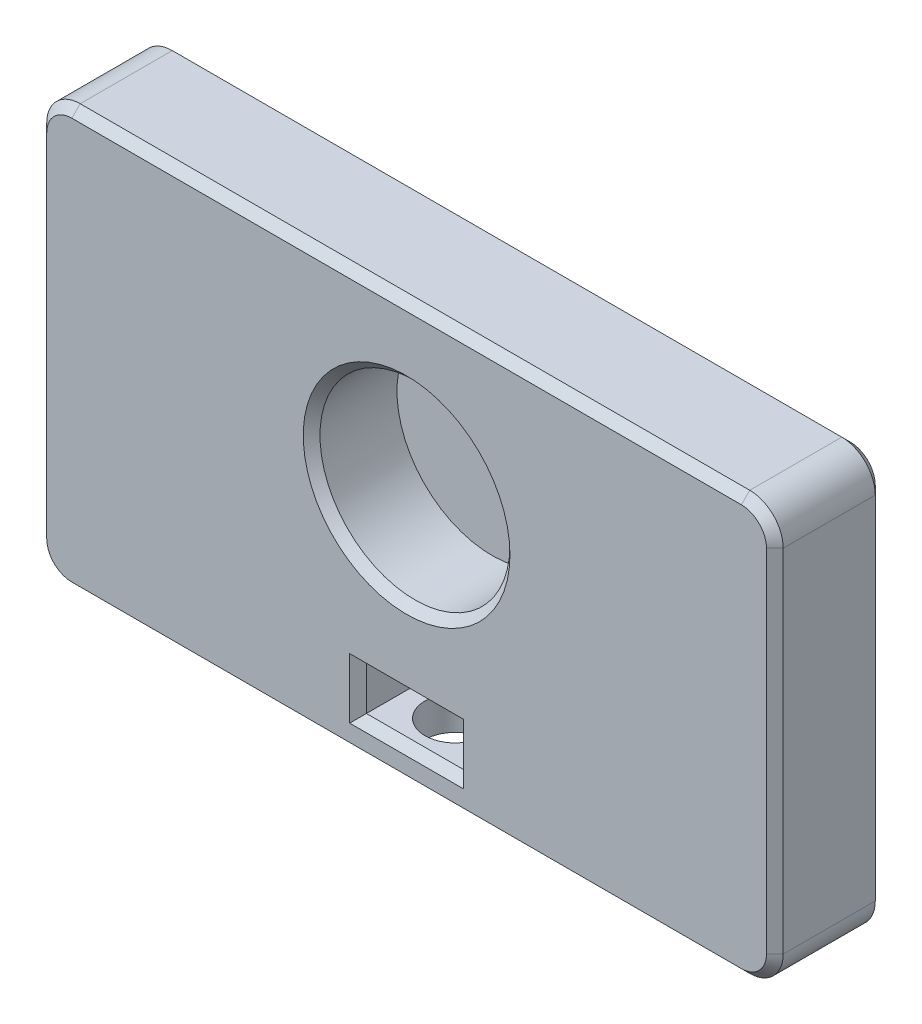
ISO-10303-21;
HEADER;
FILE_DESCRIPTION(('STEP AP214'),'2;1');
FILE_NAME('part.step','',(''),(''),'','','');
FILE_SCHEMA(('AUTOMOTIVE_DESIGN { 1 0 10303 214 1 1 1 1 }'));
ENDSEC;
DATA;
#1=APPLICATION_CONTEXT('core data for automotive mechanical design processes');
#2=APPLICATION_PROTOCOL_DEFINITION('international standard','automotive_design',2000,#1);
#3=PRODUCT_CONTEXT('',#1,'mechanical');
#4=PRODUCT('Part','Part','',(#3));
#5=PRODUCT_RELATED_PRODUCT_CATEGORY('part','',(#4));
#6=PRODUCT_DEFINITION_FORMATION('','',#4);
#7=PRODUCT_DEFINITION_CONTEXT('part definition',#1,'design');
#8=PRODUCT_DEFINITION('design','',#6,#7);
#9=PRODUCT_DEFINITION_SHAPE('','',#8);
#10=(LENGTH_UNIT() NAMED_UNIT(*) SI_UNIT(.MILLI.,.METRE.));
#11=(NAMED_UNIT(*) PLANE_ANGLE_UNIT() SI_UNIT($,.RADIAN.));
#12=(NAMED_UNIT(*) SI_UNIT($,.STERADIAN.) SOLID_ANGLE_UNIT());
#13=UNCERTAINTY_MEASURE_WITH_UNIT(LENGTH_MEASURE(1.E-05),#10,'distance_accuracy_value','');
#14=(GEOMETRIC_REPRESENTATION_CONTEXT(3) GLOBAL_UNCERTAINTY_ASSIGNED_CONTEXT((#13)) GLOBAL_UNIT_ASSIGNED_CONTEXT((#10,
#11,#12)) REPRESENTATION_CONTEXT('',''));
#15=CARTESIAN_POINT('',(0.,0.,0.));
#16=DIRECTION('',(0.,0.,1.));
#17=DIRECTION('',(1.,0.,0.));
#18=AXIS2_PLACEMENT_3D('',#15,#16,#17);
#19=CARTESIAN_POINT('',(0.,0.,2.));
#20=DIRECTION('',(0.,0.,1.));
#21=DIRECTION('',(1.,0.,0.));
#22=AXIS2_PLACEMENT_3D('',#19,#20,#21);
#23=PLANE('',#22);
#24=DIRECTION('',(-1.,0.,0.));
#25=VECTOR('',#24,1.);
#26=CARTESIAN_POINT('',(-2.9,-13.,2.));
#27=LINE('',#26,#25);
#28=CARTESIAN_POINT('',(-2.775,-13.,2.));
#29=VERTEX_POINT('',#28);
#30=CARTESIAN_POINT('',(-2.9,-13.,2.));
#31=VERTEX_POINT('',#30);
#32=EDGE_CURVE('E223',#29,#31,#27,.T.);
#33=ORIENTED_EDGE('',*,*,#32,.F.);
#34=DIRECTION('',(0.,1.,0.));
#35=VECTOR('',#34,1.);
#36=CARTESIAN_POINT('',(-2.775,-18.7766231485185,2.));
#37=LINE('',#36,#35);
#38=CARTESIAN_POINT('',(-2.775,-10.4,2.));
#39=VERTEX_POINT('',#38);
#40=EDGE_CURVE('E207',#29,#39,#37,.T.);
#41=ORIENTED_EDGE('',*,*,#40,.T.);
#42=DIRECTION('',(1.,0.,0.));
#43=VECTOR('',#42,1.);
#44=CARTESIAN_POINT('',(2.9,-10.4,2.));
#45=LINE('',#44,#43);
#46=CARTESIAN_POINT('',(-2.9,-10.4,2.));
#47=VERTEX_POINT('',#46);
#48=EDGE_CURVE('E252',#47,#39,#45,.T.);
#49=ORIENTED_EDGE('',*,*,#48,.F.);
#50=DIRECTION('',(0.,1.,0.));
#51=VECTOR('',#50,1.);
#52=CARTESIAN_POINT('',(-2.9,-13.,2.));
#53=LINE('',#52,#51);
#54=EDGE_CURVE('E230',#31,#47,#53,.T.);
#55=ORIENTED_EDGE('',*,*,#54,.F.);
#56=EDGE_LOOP('',(#33,#41,#49,#55));
#57=FACE_BOUND('',#56,.T.);
#58=ADVANCED_FACE('F39',(#57),#23,.T.);
#59=CARTESIAN_POINT('',(-22.,-15.,6.5));
#60=DIRECTION('',(1.,0.,0.));
#61=DIRECTION('',(0.,0.,-1.));
#62=AXIS2_PLACEMENT_3D('',#59,#60,#61);
#63=PLANE('',#62);
#64=DIRECTION('',(0.,0.,-1.));
#65=VECTOR('',#64,1.);
#66=CARTESIAN_POINT('',(-22.,-13.,6.5));
#67=LINE('',#66,#65);
#68=CARTESIAN_POINT('',(-22.,-13.,0.5));
#69=VERTEX_POINT('',#68);
#70=CARTESIAN_POINT('',(-22.,-13.,6.));
#71=VERTEX_POINT('',#70);
#72=EDGE_CURVE('E280',#69,#71,#67,.F.);
#73=ORIENTED_EDGE('',*,*,#72,.T.);
#74=DIRECTION('',(0.,1.,0.));
#75=VECTOR('',#74,1.);
#76=CARTESIAN_POINT('',(-22.,7.99999999999999,6.));
#77=LINE('',#76,#75);
#78=CARTESIAN_POINT('',(-22.,7.99999999999999,6.));
#79=VERTEX_POINT('',#78);
#80=EDGE_CURVE('E339',#71,#79,#77,.T.);
#81=ORIENTED_EDGE('',*,*,#80,.T.);
#82=DIRECTION('',(0.,0.,-1.));
#83=VECTOR('',#82,1.);
#84=CARTESIAN_POINT('',(-22.,7.99999999999999,6.5));
#85=LINE('',#84,#83);
#86=CARTESIAN_POINT('',(-22.,7.99999999999999,0.5));
#87=VERTEX_POINT('',#86);
#88=EDGE_CURVE('E283',#79,#87,#85,.T.);
#89=ORIENTED_EDGE('',*,*,#88,.T.);
#90=DIRECTION('',(0.,-1.,0.));
#91=VECTOR('',#90,1.);
#92=CARTESIAN_POINT('',(-22.,-15.,0.5));
#93=LINE('',#92,#91);
#94=EDGE_CURVE('E337',#87,#69,#93,.T.);
#95=ORIENTED_EDGE('',*,*,#94,.T.);
#96=EDGE_LOOP('',(#73,#81,#89,#95));
#97=FACE_BOUND('',#96,.T.);
#98=ADVANCED_FACE('F496',(#97),#63,.F.);
#99=CARTESIAN_POINT('',(-22.,-15.,6.5));
#100=DIRECTION('',(0.,1.,0.));
#101=DIRECTION('',(0.,0.,1.));
#102=AXIS2_PLACEMENT_3D('',#99,#100,#101);
#103=PLANE('',#102);
#104=CARTESIAN_POINT('',(0.,-15.,3.60214699700122));
#105=DIRECTION('',(0.,-1.,0.));
#106=DIRECTION('',(0.,0.,-1.));
#107=AXIS2_PLACEMENT_3D('',#104,#105,#106);
#108=CIRCLE('',#107,1.8);
#109=CARTESIAN_POINT('',(0.,-15.,1.80214699700122));
#110=VERTEX_POINT('',#109);
#111=EDGE_CURVE('E409',#110,#110,#108,.T.);
#112=ORIENTED_EDGE('',*,*,#111,.F.);
#113=EDGE_LOOP('',(#112));
#114=FACE_BOUND('',#113,.T.);
#115=DIRECTION('',(0.,0.,-1.));
#116=VECTOR('',#115,1.);
#117=CARTESIAN_POINT('',(20.,-15.,6.5));
#118=LINE('',#117,#116);
#119=CARTESIAN_POINT('',(20.,-15.,0.5));
#120=VERTEX_POINT('',#119);
#121=CARTESIAN_POINT('',(20.,-15.,6.));
#122=VERTEX_POINT('',#121);
#123=EDGE_CURVE('E276',#120,#122,#118,.F.);
#124=ORIENTED_EDGE('',*,*,#123,.T.);
#125=DIRECTION('',(-1.,0.,0.));
#126=VECTOR('',#125,1.);
#127=CARTESIAN_POINT('',(-20.,-15.,6.));
#128=LINE('',#127,#126);
#129=CARTESIAN_POINT('',(-20.,-15.,6.));
#130=VERTEX_POINT('',#129);
#131=EDGE_CURVE('E330',#122,#130,#128,.T.);
#132=ORIENTED_EDGE('',*,*,#131,.T.);
#133=DIRECTION('',(0.,0.,-1.));
#134=VECTOR('',#133,1.);
#135=CARTESIAN_POINT('',(-20.,-15.,6.5));
#136=LINE('',#135,#134);
#137=CARTESIAN_POINT('',(-20.,-15.,0.5));
#138=VERTEX_POINT('',#137);
#139=EDGE_CURVE('E273',#130,#138,#136,.T.);
#140=ORIENTED_EDGE('',*,*,#139,.T.);
#141=DIRECTION('',(1.,0.,0.));
#142=VECTOR('',#141,1.);
#143=CARTESIAN_POINT('',(-22.,-15.,0.5));
#144=LINE('',#143,#142);
#145=EDGE_CURVE('E327',#138,#120,#144,.T.);
#146=ORIENTED_EDGE('',*,*,#145,.T.);
#147=EDGE_LOOP('',(#124,#132,#140,#146));
#148=FACE_BOUND('',#147,.T.);
#149=ADVANCED_FACE('F470',(#114,#148),#103,.F.);
#150=CARTESIAN_POINT('',(22.,-15.,6.5));
#151=DIRECTION('',(-1.,0.,0.));
#152=DIRECTION('',(0.,0.,1.));
#153=AXIS2_PLACEMENT_3D('',#150,#151,#152);
#154=PLANE('',#153);
#155=DIRECTION('',(0.,0.,-1.));
#156=VECTOR('',#155,1.);
#157=CARTESIAN_POINT('',(22.,8.,6.5));
#158=LINE('',#157,#156);
#159=CARTESIAN_POINT('',(22.,8.,0.5));
#160=VERTEX_POINT('',#159);
#161=CARTESIAN_POINT('',(22.,8.,6.));
#162=VERTEX_POINT('',#161);
#163=EDGE_CURVE('E269',#160,#162,#158,.F.);
#164=ORIENTED_EDGE('',*,*,#163,.T.);
#165=DIRECTION('',(0.,-1.,0.));
#166=VECTOR('',#165,1.);
#167=CARTESIAN_POINT('',(22.,-13.,6.));
#168=LINE('',#167,#166);
#169=CARTESIAN_POINT('',(22.,-13.,6.));
#170=VERTEX_POINT('',#169);
#171=EDGE_CURVE('E359',#162,#170,#168,.T.);
#172=ORIENTED_EDGE('',*,*,#171,.T.);
#173=DIRECTION('',(0.,0.,-1.));
#174=VECTOR('',#173,1.);
#175=CARTESIAN_POINT('',(22.,-13.,6.5));
#176=LINE('',#175,#174);
#177=CARTESIAN_POINT('',(22.,-13.,0.5));
#178=VERTEX_POINT('',#177);
#179=EDGE_CURVE('E265',#170,#178,#176,.T.);
#180=ORIENTED_EDGE('',*,*,#179,.T.);
#181=DIRECTION('',(0.,1.,0.));
#182=VECTOR('',#181,1.);
#183=CARTESIAN_POINT('',(22.,-15.,0.5));
#184=LINE('',#183,#182);
#185=EDGE_CURVE('E357',#178,#160,#184,.T.);
#186=ORIENTED_EDGE('',*,*,#185,.T.);
#187=EDGE_LOOP('',(#164,#172,#180,#186));
#188=FACE_BOUND('',#187,.T.);
#189=ADVANCED_FACE('F456',(#188),#154,.F.);
#190=CARTESIAN_POINT('',(22.,10.,6.5));
#191=DIRECTION('',(0.,-1.,0.));
#192=DIRECTION('',(1.,0.,0.));
#193=AXIS2_PLACEMENT_3D('',#190,#191,#192);
#194=PLANE('',#193);
#195=DIRECTION('',(0.,0.,-1.));
#196=VECTOR('',#195,1.);
#197=CARTESIAN_POINT('',(-20.,9.99999999999999,6.5));
#198=LINE('',#197,#196);
#199=CARTESIAN_POINT('',(-20.,9.99999999999999,0.5));
#200=VERTEX_POINT('',#199);
#201=CARTESIAN_POINT('',(-20.,9.99999999999999,6.));
#202=VERTEX_POINT('',#201);
#203=EDGE_CURVE('E258',#200,#202,#198,.F.);
#204=ORIENTED_EDGE('',*,*,#203,.T.);
#205=DIRECTION('',(1.,0.,0.));
#206=VECTOR('',#205,1.);
#207=CARTESIAN_POINT('',(20.,10.,6.));
#208=LINE('',#207,#206);
#209=CARTESIAN_POINT('',(20.,10.,6.));
#210=VERTEX_POINT('',#209);
#211=EDGE_CURVE('E349',#202,#210,#208,.T.);
#212=ORIENTED_EDGE('',*,*,#211,.T.);
#213=DIRECTION('',(0.,0.,-1.));
#214=VECTOR('',#213,1.);
#215=CARTESIAN_POINT('',(20.,10.,6.5));
#216=LINE('',#215,#214);
#217=CARTESIAN_POINT('',(20.,10.,0.5));
#218=VERTEX_POINT('',#217);
#219=EDGE_CURVE('E261',#210,#218,#216,.T.);
#220=ORIENTED_EDGE('',*,*,#219,.T.);
#221=DIRECTION('',(-1.,0.,0.));
#222=VECTOR('',#221,1.);
#223=CARTESIAN_POINT('',(22.,10.,0.5));
#224=LINE('',#223,#222);
#225=EDGE_CURVE('E346',#218,#200,#224,.T.);
#226=ORIENTED_EDGE('',*,*,#225,.T.);
#227=EDGE_LOOP('',(#204,#212,#220,#226));
#228=FACE_BOUND('',#227,.T.);
#229=ADVANCED_FACE('F513',(#228),#194,.F.);
#230=CARTESIAN_POINT('',(0.,0.,6.5));
#231=DIRECTION('',(0.,0.,1.));
#232=DIRECTION('',(1.,0.,0.));
#233=AXIS2_PLACEMENT_3D('',#230,#231,#232);
#234=PLANE('',#233);
#235=DIRECTION('',(1.,0.,0.));
#236=VECTOR('',#235,1.);
#237=CARTESIAN_POINT('',(20.,-14.5,6.5));
#238=LINE('',#237,#236);
#239=CARTESIAN_POINT('',(-20.,-14.5,6.5));
#240=VERTEX_POINT('',#239);
#241=CARTESIAN_POINT('',(20.,-14.5,6.5));
#242=VERTEX_POINT('',#241);
#243=EDGE_CURVE('E316',#240,#242,#238,.T.);
#244=ORIENTED_EDGE('',*,*,#243,.T.);
#245=CARTESIAN_POINT('',(20.,-13.,6.5));
#246=DIRECTION('',(0.,0.,1.));
#247=DIRECTION('',(1.,0.,0.));
#248=AXIS2_PLACEMENT_3D('',#245,#246,#247);
#249=CIRCLE('',#248,1.50000000000001);
#250=CARTESIAN_POINT('',(21.5,-13.,6.5));
#251=VERTEX_POINT('',#250);
#252=EDGE_CURVE('E319',#242,#251,#249,.T.);
#253=ORIENTED_EDGE('',*,*,#252,.T.);
#254=DIRECTION('',(0.,1.,0.));
#255=VECTOR('',#254,1.);
#256=CARTESIAN_POINT('',(21.5,7.99999999999999,6.5));
#257=LINE('',#256,#255);
#258=CARTESIAN_POINT('',(21.5,8.,6.5));
#259=VERTEX_POINT('',#258);
#260=EDGE_CURVE('E303',#251,#259,#257,.T.);
#261=ORIENTED_EDGE('',*,*,#260,.T.);
#262=CARTESIAN_POINT('',(20.,8.,6.5));
#263=DIRECTION('',(0.,0.,1.));
#264=DIRECTION('',(1.,0.,0.));
#265=AXIS2_PLACEMENT_3D('',#262,#263,#264);
#266=CIRCLE('',#265,1.5);
#267=CARTESIAN_POINT('',(20.,9.5,6.5));
#268=VERTEX_POINT('',#267);
#269=EDGE_CURVE('E305',#259,#268,#266,.T.);
#270=ORIENTED_EDGE('',*,*,#269,.T.);
#271=DIRECTION('',(-1.,0.,0.));
#272=VECTOR('',#271,1.);
#273=CARTESIAN_POINT('',(-20.,9.5,6.5));
#274=LINE('',#273,#272);
#275=CARTESIAN_POINT('',(-20.,9.5,6.5));
#276=VERTEX_POINT('',#275);
#277=EDGE_CURVE('E307',#268,#276,#274,.T.);
#278=ORIENTED_EDGE('',*,*,#277,.T.);
#279=CARTESIAN_POINT('',(-20.,7.99999999999999,6.5));
#280=DIRECTION('',(0.,0.,1.));
#281=DIRECTION('',(1.,0.,0.));
#282=AXIS2_PLACEMENT_3D('',#279,#280,#281);
#283=CIRCLE('',#282,1.50000000000001);
#284=CARTESIAN_POINT('',(-21.5,7.99999999999999,6.5));
#285=VERTEX_POINT('',#284);
#286=EDGE_CURVE('E310',#276,#285,#283,.T.);
#287=ORIENTED_EDGE('',*,*,#286,.T.);
#288=DIRECTION('',(0.,-1.,0.));
#289=VECTOR('',#288,1.);
#290=CARTESIAN_POINT('',(-21.5,-13.,6.5));
#291=LINE('',#290,#289);
#292=CARTESIAN_POINT('',(-21.5,-13.,6.5));
#293=VERTEX_POINT('',#292);
#294=EDGE_CURVE('E312',#285,#293,#291,.T.);
#295=ORIENTED_EDGE('',*,*,#294,.T.);
#296=CARTESIAN_POINT('',(-20.,-13.,6.5));
#297=DIRECTION('',(0.,0.,1.));
#298=DIRECTION('',(1.,0.,0.));
#299=AXIS2_PLACEMENT_3D('',#296,#297,#298);
#300=CIRCLE('',#299,1.5);
#301=EDGE_CURVE('E314',#293,#240,#300,.T.);
#302=ORIENTED_EDGE('',*,*,#301,.T.);
#303=EDGE_LOOP('',(#244,#253,#261,#270,#278,#287,#295,#302));
#304=FACE_BOUND('',#303,.T.);
#305=CARTESIAN_POINT('',(0.,0.,6.5));
#306=DIRECTION('',(0.,0.,1.));
#307=DIRECTION('',(1.,0.,0.));
#308=AXIS2_PLACEMENT_3D('',#305,#306,#307);
#309=CIRCLE('',#308,6.17499999999999);
#310=CARTESIAN_POINT('',(6.17499999999999,0.,6.5));
#311=VERTEX_POINT('',#310);
#312=EDGE_CURVE('E300',#311,#311,#309,.F.);
#313=ORIENTED_EDGE('',*,*,#312,.T.);
#314=EDGE_LOOP('',(#313));
#315=FACE_BOUND('',#314,.T.);
#316=DIRECTION('',(0.,1.,0.));
#317=VECTOR('',#316,1.);
#318=CARTESIAN_POINT('',(-3.4,-10.4,6.5));
#319=LINE('',#318,#317);
#320=CARTESIAN_POINT('',(-3.4,-13.5,6.5));
#321=VERTEX_POINT('',#320);
#322=CARTESIAN_POINT('',(-3.4,-9.9,6.5));
#323=VERTEX_POINT('',#322);
#324=EDGE_CURVE('E295',#321,#323,#319,.T.);
#325=ORIENTED_EDGE('',*,*,#324,.T.);
#326=DIRECTION('',(1.,0.,0.));
#327=VECTOR('',#326,1.);
#328=CARTESIAN_POINT('',(2.9,-9.9,6.5));
#329=LINE('',#328,#327);
#330=CARTESIAN_POINT('',(3.4,-9.9,6.5));
#331=VERTEX_POINT('',#330);
#332=EDGE_CURVE('E297',#323,#331,#329,.T.);
#333=ORIENTED_EDGE('',*,*,#332,.T.);
#334=DIRECTION('',(0.,-1.,0.));
#335=VECTOR('',#334,1.);
#336=CARTESIAN_POINT('',(3.4,-13.,6.5));
#337=LINE('',#336,#335);
#338=CARTESIAN_POINT('',(3.4,-13.5,6.5));
#339=VERTEX_POINT('',#338);
#340=EDGE_CURVE('E286',#331,#339,#337,.T.);
#341=ORIENTED_EDGE('',*,*,#340,.T.);
#342=DIRECTION('',(-1.,0.,0.));
#343=VECTOR('',#342,1.);
#344=CARTESIAN_POINT('',(-2.9,-13.5,6.5));
#345=LINE('',#344,#343);
#346=EDGE_CURVE('E293',#339,#321,#345,.T.);
#347=ORIENTED_EDGE('',*,*,#346,.T.);
#348=EDGE_LOOP('',(#325,#333,#341,#347));
#349=FACE_BOUND('',#348,.T.);
#350=ADVANCED_FACE('F486',(#304,#315,#349),#234,.T.);
#351=CARTESIAN_POINT('',(0.,0.,0.));
#352=DIRECTION('',(0.,0.,1.));
#353=DIRECTION('',(1.,0.,0.));
#354=AXIS2_PLACEMENT_3D('',#351,#352,#353);
#355=PLANE('',#354);
#356=DIRECTION('',(0.,1.,0.));
#357=VECTOR('',#356,1.);
#358=CARTESIAN_POINT('',(-21.5,0.,0.));
#359=LINE('',#358,#357);
#360=CARTESIAN_POINT('',(-21.5,-13.,0.));
#361=VERTEX_POINT('',#360);
#362=CARTESIAN_POINT('',(-21.5,7.99999999999999,0.));
#363=VERTEX_POINT('',#362);
#364=EDGE_CURVE('E49',#361,#363,#359,.T.);
#365=ORIENTED_EDGE('',*,*,#364,.T.);
#366=CARTESIAN_POINT('',(-20.,7.99999999999999,0.));
#367=DIRECTION('',(0.,0.,1.));
#368=DIRECTION('',(1.,0.,0.));
#369=AXIS2_PLACEMENT_3D('',#366,#367,#368);
#370=CIRCLE('',#369,1.5);
#371=CARTESIAN_POINT('',(-20.,9.49999999999999,0.));
#372=VERTEX_POINT('',#371);
#373=EDGE_CURVE('E12',#363,#372,#370,.F.);
#374=ORIENTED_EDGE('',*,*,#373,.T.);
#375=DIRECTION('',(1.,0.,0.));
#376=VECTOR('',#375,1.);
#377=CARTESIAN_POINT('',(0.,9.5,0.));
#378=LINE('',#377,#376);
#379=CARTESIAN_POINT('',(20.,9.5,0.));
#380=VERTEX_POINT('',#379);
#381=EDGE_CURVE('E373',#372,#380,#378,.T.);
#382=ORIENTED_EDGE('',*,*,#381,.T.);
#383=CARTESIAN_POINT('',(20.,8.,0.));
#384=DIRECTION('',(0.,0.,1.));
#385=DIRECTION('',(1.,0.,0.));
#386=AXIS2_PLACEMENT_3D('',#383,#384,#385);
#387=CIRCLE('',#386,1.5);
#388=CARTESIAN_POINT('',(21.5,8.,0.));
#389=VERTEX_POINT('',#388);
#390=EDGE_CURVE('E376',#380,#389,#387,.F.);
#391=ORIENTED_EDGE('',*,*,#390,.T.);
#392=DIRECTION('',(0.,-1.,0.));
#393=VECTOR('',#392,1.);
#394=CARTESIAN_POINT('',(21.5,0.,0.));
#395=LINE('',#394,#393);
#396=CARTESIAN_POINT('',(21.5,-13.,0.));
#397=VERTEX_POINT('',#396);
#398=EDGE_CURVE('E378',#389,#397,#395,.T.);
#399=ORIENTED_EDGE('',*,*,#398,.T.);
#400=CARTESIAN_POINT('',(20.,-13.,0.));
#401=DIRECTION('',(0.,0.,1.));
#402=DIRECTION('',(1.,0.,0.));
#403=AXIS2_PLACEMENT_3D('',#400,#401,#402);
#404=CIRCLE('',#403,1.5);
#405=CARTESIAN_POINT('',(20.,-14.5,0.));
#406=VERTEX_POINT('',#405);
#407=EDGE_CURVE('E380',#397,#406,#404,.F.);
#408=ORIENTED_EDGE('',*,*,#407,.T.);
#409=DIRECTION('',(-1.,0.,0.));
#410=VECTOR('',#409,1.);
#411=CARTESIAN_POINT('',(0.,-14.5,0.));
#412=LINE('',#411,#410);
#413=CARTESIAN_POINT('',(-20.,-14.5,0.));
#414=VERTEX_POINT('',#413);
#415=EDGE_CURVE('E382',#406,#414,#412,.T.);
#416=ORIENTED_EDGE('',*,*,#415,.T.);
#417=CARTESIAN_POINT('',(-20.,-13.,0.));
#418=DIRECTION('',(0.,0.,1.));
#419=DIRECTION('',(1.,0.,0.));
#420=AXIS2_PLACEMENT_3D('',#417,#418,#419);
#421=CIRCLE('',#420,1.5);
#422=EDGE_CURVE('E60',#414,#361,#421,.F.);
#423=ORIENTED_EDGE('',*,*,#422,.T.);
#424=EDGE_LOOP('',(#365,#374,#382,#391,#399,#408,#416,#423));
#425=FACE_BOUND('',#424,.T.);
#426=ADVANCED_FACE('F603',(#425),#355,.F.);
#427=CARTESIAN_POINT('',(0.,0.,1.4));
#428=DIRECTION('',(0.,0.,1.));
#429=DIRECTION('',(1.,0.,0.));
#430=AXIS2_PLACEMENT_3D('',#427,#428,#429);
#431=CYLINDRICAL_SURFACE('',#430,5.675);
#432=CARTESIAN_POINT('',(0.,0.,6.00000000000001));
#433=DIRECTION('',(0.,0.,1.));
#434=DIRECTION('',(1.,0.,0.));
#435=AXIS2_PLACEMENT_3D('',#432,#433,#434);
#436=CIRCLE('',#435,5.675);
#437=CARTESIAN_POINT('',(5.675,0.,6.00000000000001));
#438=VERTEX_POINT('',#437);
#439=EDGE_CURVE('E361',#438,#438,#436,.T.);
#440=ORIENTED_EDGE('',*,*,#439,.T.);
#441=EDGE_LOOP('',(#440));
#442=FACE_BOUND('',#441,.T.);
#443=CARTESIAN_POINT('',(0.,0.,1.4));
#444=DIRECTION('',(0.,0.,1.));
#445=DIRECTION('',(1.,0.,0.));
#446=AXIS2_PLACEMENT_3D('',#443,#444,#445);
#447=CIRCLE('',#446,5.675);
#448=CARTESIAN_POINT('',(5.675,0.,1.4));
#449=VERTEX_POINT('',#448);
#450=EDGE_CURVE('E254',#449,#449,#447,.T.);
#451=ORIENTED_EDGE('',*,*,#450,.F.);
#452=EDGE_LOOP('',(#451));
#453=FACE_BOUND('',#452,.T.);
#454=ADVANCED_FACE('F609',(#442,#453),#431,.F.);
#455=CARTESIAN_POINT('',(0.,0.,1.4));
#456=DIRECTION('',(0.,0.,1.));
#457=DIRECTION('',(1.,0.,0.));
#458=AXIS2_PLACEMENT_3D('',#455,#456,#457);
#459=PLANE('',#458);
#460=ORIENTED_EDGE('',*,*,#450,.T.);
#461=EDGE_LOOP('',(#460));
#462=FACE_BOUND('',#461,.T.);
#463=ADVANCED_FACE('F622',(#462),#459,.T.);
#464=CARTESIAN_POINT('',(20.,8.,6.5));
#465=DIRECTION('',(0.,0.,-1.));
#466=DIRECTION('',(-1.,0.,0.));
#467=AXIS2_PLACEMENT_3D('',#464,#465,#466);
#468=CYLINDRICAL_SURFACE('',#467,2.);
#469=ORIENTED_EDGE('',*,*,#219,.F.);
#470=CARTESIAN_POINT('',(20.,8.,6.));
#471=DIRECTION('',(0.,0.,1.));
#472=DIRECTION('',(1.,0.,0.));
#473=AXIS2_PLACEMENT_3D('',#470,#471,#472);
#474=CIRCLE('',#473,2.);
#475=EDGE_CURVE('E355',#210,#162,#474,.F.);
#476=ORIENTED_EDGE('',*,*,#475,.T.);
#477=ORIENTED_EDGE('',*,*,#163,.F.);
#478=CARTESIAN_POINT('',(20.,8.,0.5));
#479=DIRECTION('',(0.,0.,1.));
#480=DIRECTION('',(1.,0.,0.));
#481=AXIS2_PLACEMENT_3D('',#478,#479,#480);
#482=CIRCLE('',#481,2.);
#483=EDGE_CURVE('E352',#160,#218,#482,.T.);
#484=ORIENTED_EDGE('',*,*,#483,.T.);
#485=EDGE_LOOP('',(#469,#476,#477,#484));
#486=FACE_BOUND('',#485,.T.);
#487=ADVANCED_FACE('F516',(#486),#468,.T.);
#488=CARTESIAN_POINT('',(20.,-13.,6.5));
#489=DIRECTION('',(0.,0.,-1.));
#490=DIRECTION('',(-1.,0.,0.));
#491=AXIS2_PLACEMENT_3D('',#488,#489,#490);
#492=CYLINDRICAL_SURFACE('',#491,2.);
#493=ORIENTED_EDGE('',*,*,#179,.F.);
#494=CARTESIAN_POINT('',(20.,-13.,6.));
#495=DIRECTION('',(0.,0.,1.));
#496=DIRECTION('',(1.,0.,0.));
#497=AXIS2_PLACEMENT_3D('',#494,#495,#496);
#498=CIRCLE('',#497,2.);
#499=EDGE_CURVE('E324',#170,#122,#498,.F.);
#500=ORIENTED_EDGE('',*,*,#499,.T.);
#501=ORIENTED_EDGE('',*,*,#123,.F.);
#502=CARTESIAN_POINT('',(20.,-13.,0.5));
#503=DIRECTION('',(0.,0.,1.));
#504=DIRECTION('',(1.,0.,0.));
#505=AXIS2_PLACEMENT_3D('',#502,#503,#504);
#506=CIRCLE('',#505,2.);
#507=EDGE_CURVE('E322',#120,#178,#506,.T.);
#508=ORIENTED_EDGE('',*,*,#507,.T.);
#509=EDGE_LOOP('',(#493,#500,#501,#508));
#510=FACE_BOUND('',#509,.T.);
#511=ADVANCED_FACE('F453',(#510),#492,.T.);
#512=CARTESIAN_POINT('',(-20.,7.99999999999999,6.5));
#513=DIRECTION('',(0.,0.,-1.));
#514=DIRECTION('',(-1.,0.,0.));
#515=AXIS2_PLACEMENT_3D('',#512,#513,#514);
#516=CYLINDRICAL_SURFACE('',#515,2.);
#517=ORIENTED_EDGE('',*,*,#88,.F.);
#518=CARTESIAN_POINT('',(-20.,7.99999999999999,6.));
#519=DIRECTION('',(0.,0.,1.));
#520=DIRECTION('',(1.,0.,0.));
#521=AXIS2_PLACEMENT_3D('',#518,#519,#520);
#522=CIRCLE('',#521,2.);
#523=EDGE_CURVE('E344',#79,#202,#522,.F.);
#524=ORIENTED_EDGE('',*,*,#523,.T.);
#525=ORIENTED_EDGE('',*,*,#203,.F.);
#526=CARTESIAN_POINT('',(-20.,7.99999999999999,0.5));
#527=DIRECTION('',(0.,0.,1.));
#528=DIRECTION('',(1.,0.,0.));
#529=AXIS2_PLACEMENT_3D('',#526,#527,#528);
#530=CIRCLE('',#529,2.);
#531=EDGE_CURVE('E341',#200,#87,#530,.T.);
#532=ORIENTED_EDGE('',*,*,#531,.T.);
#533=EDGE_LOOP('',(#517,#524,#525,#532));
#534=FACE_BOUND('',#533,.T.);
#535=ADVANCED_FACE('F499',(#534),#516,.T.);
#536=CARTESIAN_POINT('',(-20.,-13.,6.5));
#537=DIRECTION('',(0.,0.,-1.));
#538=DIRECTION('',(-1.,0.,0.));
#539=AXIS2_PLACEMENT_3D('',#536,#537,#538);
#540=CYLINDRICAL_SURFACE('',#539,2.);
#541=ORIENTED_EDGE('',*,*,#139,.F.);
#542=CARTESIAN_POINT('',(-20.,-13.,6.));
#543=DIRECTION('',(0.,0.,1.));
#544=DIRECTION('',(1.,0.,0.));
#545=AXIS2_PLACEMENT_3D('',#542,#543,#544);
#546=CIRCLE('',#545,2.);
#547=EDGE_CURVE('E335',#130,#71,#546,.F.);
#548=ORIENTED_EDGE('',*,*,#547,.T.);
#549=ORIENTED_EDGE('',*,*,#72,.F.);
#550=CARTESIAN_POINT('',(-20.,-13.,0.5));
#551=DIRECTION('',(0.,0.,1.));
#552=DIRECTION('',(1.,0.,0.));
#553=AXIS2_PLACEMENT_3D('',#550,#551,#552);
#554=CIRCLE('',#553,2.);
#555=EDGE_CURVE('E333',#69,#138,#554,.T.);
#556=ORIENTED_EDGE('',*,*,#555,.T.);
#557=EDGE_LOOP('',(#541,#548,#549,#556));
#558=FACE_BOUND('',#557,.T.);
#559=ADVANCED_FACE('F474',(#558),#540,.T.);
#560=CARTESIAN_POINT('',(2.9,-13.,-6.35609943282828));
#561=DIRECTION('',(1.,0.,0.));
#562=DIRECTION('',(0.,0.,-1.));
#563=AXIS2_PLACEMENT_3D('',#560,#561,#562);
#564=PLANE('',#563);
#565=DIRECTION('',(0.,0.,1.));
#566=VECTOR('',#565,1.);
#567=CARTESIAN_POINT('',(2.9,-13.,-6.35609943282828));
#568=LINE('',#567,#566);
#569=CARTESIAN_POINT('',(2.9,-13.,2.));
#570=VERTEX_POINT('',#569);
#571=CARTESIAN_POINT('',(2.9,-13.,6.));
#572=VERTEX_POINT('',#571);
#573=EDGE_CURVE('E235',#570,#572,#568,.T.);
#574=ORIENTED_EDGE('',*,*,#573,.T.);
#575=DIRECTION('',(0.,1.,0.));
#576=VECTOR('',#575,1.);
#577=CARTESIAN_POINT('',(2.9,-10.4,6.));
#578=LINE('',#577,#576);
#579=CARTESIAN_POINT('',(2.9,-10.4,6.));
#580=VERTEX_POINT('',#579);
#581=EDGE_CURVE('E371',#572,#580,#578,.T.);
#582=ORIENTED_EDGE('',*,*,#581,.T.);
#583=DIRECTION('',(0.,0.,1.));
#584=VECTOR('',#583,1.);
#585=CARTESIAN_POINT('',(2.9,-10.4,-6.35609943282828));
#586=LINE('',#585,#584);
#587=CARTESIAN_POINT('',(2.9,-10.4,2.));
#588=VERTEX_POINT('',#587);
#589=EDGE_CURVE('E227',#588,#580,#586,.T.);
#590=ORIENTED_EDGE('',*,*,#589,.F.);
#591=DIRECTION('',(0.,-1.,0.));
#592=VECTOR('',#591,1.);
#593=CARTESIAN_POINT('',(2.9,-13.,2.));
#594=LINE('',#593,#592);
#595=EDGE_CURVE('E234',#588,#570,#594,.T.);
#596=ORIENTED_EDGE('',*,*,#595,.T.);
#597=EDGE_LOOP('',(#574,#582,#590,#596));
#598=FACE_BOUND('',#597,.T.);
#599=ADVANCED_FACE('F578',(#598),#564,.F.);
#600=CARTESIAN_POINT('',(-2.9,-13.,-6.35609943282828));
#601=DIRECTION('',(0.,-1.,0.));
#602=DIRECTION('',(0.,0.,-1.));
#603=AXIS2_PLACEMENT_3D('',#600,#601,#602);
#604=PLANE('',#603);
#605=CARTESIAN_POINT('',(0.,-13.,3.60214699700122));
#606=DIRECTION('',(0.,-1.,0.));
#607=DIRECTION('',(0.,0.,-1.));
#608=AXIS2_PLACEMENT_3D('',#605,#606,#607);
#609=CIRCLE('',#608,1.8);
#610=CARTESIAN_POINT('',(0.,-13.,1.80214699700122));
#611=VERTEX_POINT('',#610);
#612=EDGE_CURVE('E290',#611,#611,#609,.T.);
#613=ORIENTED_EDGE('',*,*,#612,.T.);
#614=EDGE_LOOP('',(#613));
#615=FACE_BOUND('',#614,.T.);
#616=DIRECTION('',(0.,0.,1.));
#617=VECTOR('',#616,1.);
#618=CARTESIAN_POINT('',(-2.9,-13.,-6.35609943282828));
#619=LINE('',#618,#617);
#620=CARTESIAN_POINT('',(-2.9,-13.,6.));
#621=VERTEX_POINT('',#620);
#622=EDGE_CURVE('E244',#31,#621,#619,.T.);
#623=ORIENTED_EDGE('',*,*,#622,.T.);
#624=DIRECTION('',(1.,0.,0.));
#625=VECTOR('',#624,1.);
#626=CARTESIAN_POINT('',(2.9,-13.,6.));
#627=LINE('',#626,#625);
#628=EDGE_CURVE('E369',#621,#572,#627,.T.);
#629=ORIENTED_EDGE('',*,*,#628,.T.);
#630=ORIENTED_EDGE('',*,*,#573,.F.);
#631=CARTESIAN_POINT('',(2.775,-13.,2.));
#632=VERTEX_POINT('',#631);
#633=EDGE_CURVE('E232',#570,#632,#27,.T.);
#634=ORIENTED_EDGE('',*,*,#633,.T.);
#635=DIRECTION('',(-0.86602540378444,0.,-0.499999999999998));
#636=VECTOR('',#635,1.);
#637=CARTESIAN_POINT('',(-0.172275403784442,-13.,0.298389752249099));
#638=LINE('',#637,#636);
#639=CARTESIAN_POINT('',(0.,-13.,0.397853002998798));
#640=VERTEX_POINT('',#639);
#641=EDGE_CURVE('E226',#632,#640,#638,.T.);
#642=ORIENTED_EDGE('',*,*,#641,.T.);
#643=DIRECTION('',(0.86602540378444,0.,-0.499999999999998));
#644=VECTOR('',#643,1.);
#645=CARTESIAN_POINT('',(0.172275403784442,-13.,0.298389752249099));
#646=LINE('',#645,#644);
#647=EDGE_CURVE('E210',#29,#640,#646,.T.);
#648=ORIENTED_EDGE('',*,*,#647,.F.);
#649=ORIENTED_EDGE('',*,*,#32,.T.);
#650=EDGE_LOOP('',(#623,#629,#630,#634,#642,#648,#649));
#651=FACE_BOUND('',#650,.T.);
#652=ADVANCED_FACE('F222',(#615,#651),#604,.F.);
#653=CARTESIAN_POINT('',(-2.9,-13.,-6.35609943282828));
#654=DIRECTION('',(-1.,0.,0.));
#655=DIRECTION('',(0.,-1.,0.));
#656=AXIS2_PLACEMENT_3D('',#653,#654,#655);
#657=PLANE('',#656);
#658=DIRECTION('',(0.,0.,1.));
#659=VECTOR('',#658,1.);
#660=CARTESIAN_POINT('',(-2.9,-10.4,-6.35609943282828));
#661=LINE('',#660,#659);
#662=CARTESIAN_POINT('',(-2.9,-10.4,6.));
#663=VERTEX_POINT('',#662);
#664=EDGE_CURVE('E246',#47,#663,#661,.T.);
#665=ORIENTED_EDGE('',*,*,#664,.T.);
#666=DIRECTION('',(0.,-1.,0.));
#667=VECTOR('',#666,1.);
#668=CARTESIAN_POINT('',(-2.9,-13.,6.));
#669=LINE('',#668,#667);
#670=EDGE_CURVE('E367',#663,#621,#669,.T.);
#671=ORIENTED_EDGE('',*,*,#670,.T.);
#672=ORIENTED_EDGE('',*,*,#622,.F.);
#673=ORIENTED_EDGE('',*,*,#54,.T.);
#674=EDGE_LOOP('',(#665,#671,#672,#673));
#675=FACE_BOUND('',#674,.T.);
#676=ADVANCED_FACE('F563',(#675),#657,.F.);
#677=CARTESIAN_POINT('',(2.9,-10.4,-6.35609943282828));
#678=DIRECTION('',(0.,1.,0.));
#679=DIRECTION('',(0.,0.,1.));
#680=AXIS2_PLACEMENT_3D('',#677,#678,#679);
#681=PLANE('',#680);
#682=CARTESIAN_POINT('',(0.,-10.4,3.60214699700122));
#683=DIRECTION('',(0.,1.,0.));
#684=DIRECTION('',(0.,0.,1.));
#685=AXIS2_PLACEMENT_3D('',#682,#683,#684);
#686=CIRCLE('',#685,1.8);
#687=CARTESIAN_POINT('',(0.,-10.4,5.40214699700122));
#688=VERTEX_POINT('',#687);
#689=EDGE_CURVE('E287',#688,#688,#686,.T.);
#690=ORIENTED_EDGE('',*,*,#689,.T.);
#691=EDGE_LOOP('',(#690));
#692=FACE_BOUND('',#691,.T.);
#693=ORIENTED_EDGE('',*,*,#589,.T.);
#694=DIRECTION('',(-1.,0.,0.));
#695=VECTOR('',#694,1.);
#696=CARTESIAN_POINT('',(-2.9,-10.4,6.));
#697=LINE('',#696,#695);
#698=EDGE_CURVE('E364',#580,#663,#697,.T.);
#699=ORIENTED_EDGE('',*,*,#698,.T.);
#700=ORIENTED_EDGE('',*,*,#664,.F.);
#701=ORIENTED_EDGE('',*,*,#48,.T.);
#702=DIRECTION('',(0.86602540378444,0.,-0.499999999999998));
#703=VECTOR('',#702,1.);
#704=CARTESIAN_POINT('',(0.172275403784442,-10.4,0.298389752249099));
#705=LINE('',#704,#703);
#706=CARTESIAN_POINT('',(0.,-10.4,0.397853002998798));
#707=VERTEX_POINT('',#706);
#708=EDGE_CURVE('E212',#39,#707,#705,.T.);
#709=ORIENTED_EDGE('',*,*,#708,.T.);
#710=DIRECTION('',(-0.86602540378444,0.,-0.499999999999998));
#711=VECTOR('',#710,1.);
#712=CARTESIAN_POINT('',(-0.172275403784442,-10.4,0.298389752249099));
#713=LINE('',#712,#711);
#714=CARTESIAN_POINT('',(2.775,-10.4,2.));
#715=VERTEX_POINT('',#714);
#716=EDGE_CURVE('E228',#715,#707,#713,.T.);
#717=ORIENTED_EDGE('',*,*,#716,.F.);
#718=EDGE_CURVE('E240',#715,#588,#45,.T.);
#719=ORIENTED_EDGE('',*,*,#718,.T.);
#720=EDGE_LOOP('',(#693,#699,#700,#701,#709,#717,#719));
#721=FACE_BOUND('',#720,.T.);
#722=ADVANCED_FACE('F556',(#692,#721),#681,.F.);
#723=DIRECTION('',(0.,1.,0.));
#724=VECTOR('',#723,1.);
#725=CARTESIAN_POINT('',(2.775,-18.7766231485185,2.));
#726=LINE('',#725,#724);
#727=EDGE_CURVE('E217',#632,#715,#726,.T.);
#728=ORIENTED_EDGE('',*,*,#727,.F.);
#729=ORIENTED_EDGE('',*,*,#633,.F.);
#730=ORIENTED_EDGE('',*,*,#595,.F.);
#731=ORIENTED_EDGE('',*,*,#718,.F.);
#732=EDGE_LOOP('',(#728,#729,#730,#731));
#733=FACE_BOUND('',#732,.T.);
#734=ADVANCED_FACE('F547',(#733),#23,.T.);
#735=CARTESIAN_POINT('',(-0.172275403784442,-18.7766231485185,0.298389752249099));
#736=DIRECTION('',(0.499999999999998,0.,-0.86602540378444));
#737=DIRECTION('',(-0.86602540378444,0.,-0.499999999999998));
#738=AXIS2_PLACEMENT_3D('',#735,#736,#737);
#739=PLANE('',#738);
#740=ORIENTED_EDGE('',*,*,#727,.T.);
#741=ORIENTED_EDGE('',*,*,#716,.T.);
#742=DIRECTION('',(0.,1.,0.));
#743=VECTOR('',#742,1.);
#744=CARTESIAN_POINT('',(0.,-18.7766231485185,0.397853002998798));
#745=LINE('',#744,#743);
#746=EDGE_CURVE('E573',#640,#707,#745,.T.);
#747=ORIENTED_EDGE('',*,*,#746,.F.);
#748=ORIENTED_EDGE('',*,*,#641,.F.);
#749=EDGE_LOOP('',(#740,#741,#747,#748));
#750=FACE_BOUND('',#749,.T.);
#751=ADVANCED_FACE('F555',(#750),#739,.F.);
#752=CARTESIAN_POINT('',(0.172275403784442,-18.7766231485185,0.298389752249099));
#753=DIRECTION('',(0.499999999999998,0.,0.86602540378444));
#754=DIRECTION('',(0.86602540378444,0.,-0.499999999999998));
#755=AXIS2_PLACEMENT_3D('',#752,#753,#754);
#756=PLANE('',#755);
#757=ORIENTED_EDGE('',*,*,#647,.T.);
#758=ORIENTED_EDGE('',*,*,#746,.T.);
#759=ORIENTED_EDGE('',*,*,#708,.F.);
#760=ORIENTED_EDGE('',*,*,#40,.F.);
#761=EDGE_LOOP('',(#757,#758,#759,#760));
#762=FACE_BOUND('',#761,.T.);
#763=ADVANCED_FACE('F209',(#762),#756,.T.);
#764=CARTESIAN_POINT('',(0.,-6.3,0.));
#765=DIRECTION('',(0.,-1.,0.));
#766=DIRECTION('',(0.,0.,-1.));
#767=AXIS2_PLACEMENT_3D('',#764,#765,#766);
#768=PLANE('',#767);
#769=CARTESIAN_POINT('',(0.,-6.3,3.60214699700122));
#770=DIRECTION('',(0.,-1.,0.));
#771=DIRECTION('',(0.,0.,-1.));
#772=AXIS2_PLACEMENT_3D('',#769,#770,#771);
#773=CIRCLE('',#772,1.8);
#774=CARTESIAN_POINT('',(0.,-6.3,1.80214699700122));
#775=VERTEX_POINT('',#774);
#776=EDGE_CURVE('E291',#775,#775,#773,.T.);
#777=ORIENTED_EDGE('',*,*,#776,.T.);
#778=EDGE_LOOP('',(#777));
#779=FACE_BOUND('',#778,.T.);
#780=ADVANCED_FACE('F800',(#779),#768,.T.);
#781=CARTESIAN_POINT('',(0.,-6.3,3.60214699700122));
#782=DIRECTION('',(0.,-1.,0.));
#783=DIRECTION('',(0.,0.,-1.));
#784=AXIS2_PLACEMENT_3D('',#781,#782,#783);
#785=CYLINDRICAL_SURFACE('',#784,1.8);
#786=ORIENTED_EDGE('',*,*,#776,.F.);
#787=EDGE_LOOP('',(#786));
#788=FACE_BOUND('',#787,.T.);
#789=ORIENTED_EDGE('',*,*,#689,.F.);
#790=EDGE_LOOP('',(#789));
#791=FACE_BOUND('',#790,.T.);
#792=ADVANCED_FACE('F791',(#788,#791),#785,.F.);
#793=ORIENTED_EDGE('',*,*,#111,.T.);
#794=EDGE_LOOP('',(#793));
#795=FACE_BOUND('',#794,.T.);
#796=ORIENTED_EDGE('',*,*,#612,.F.);
#797=EDGE_LOOP('',(#796));
#798=FACE_BOUND('',#797,.T.);
#799=ADVANCED_FACE('F673',(#795,#798),#785,.F.);
#800=CARTESIAN_POINT('',(-20.,7.99999999999999,6.5));
#801=DIRECTION('',(0.,0.,-1.));
#802=DIRECTION('',(-1.,0.,0.));
#803=AXIS2_PLACEMENT_3D('',#800,#801,#802);
#804=CONICAL_SURFACE('',#803,1.50000000000001,0.785398163397441);
#805=DIRECTION('',(0.,-0.707106781186541,0.707106781186554));
#806=VECTOR('',#805,1.);
#807=CARTESIAN_POINT('',(-20.,9.99999999999999,6.));
#808=LINE('',#807,#806);
#809=EDGE_CURVE('E403',#202,#276,#808,.T.);
#810=ORIENTED_EDGE('',*,*,#809,.F.);
#811=ORIENTED_EDGE('',*,*,#523,.F.);
#812=DIRECTION('',(-0.70710678118654,0.,-0.707106781186555));
#813=VECTOR('',#812,1.);
#814=CARTESIAN_POINT('',(-21.5,7.99999999999999,6.5));
#815=LINE('',#814,#813);
#816=EDGE_CURVE('E406',#285,#79,#815,.T.);
#817=ORIENTED_EDGE('',*,*,#816,.F.);
#818=ORIENTED_EDGE('',*,*,#286,.F.);
#819=EDGE_LOOP('',(#810,#811,#817,#818));
#820=FACE_BOUND('',#819,.T.);
#821=ADVANCED_FACE('F504',(#820),#804,.T.);
#822=CARTESIAN_POINT('',(-21.5,0.,6.5));
#823=DIRECTION('',(-0.707106781186552,0.,0.707106781186543));
#824=DIRECTION('',(0.,1.,0.));
#825=AXIS2_PLACEMENT_3D('',#822,#823,#824);
#826=PLANE('',#825);
#827=ORIENTED_EDGE('',*,*,#816,.T.);
#828=ORIENTED_EDGE('',*,*,#80,.F.);
#829=DIRECTION('',(-0.707106781186543,0.,-0.707106781186552));
#830=VECTOR('',#829,1.);
#831=CARTESIAN_POINT('',(-21.5,-13.,6.5));
#832=LINE('',#831,#830);
#833=EDGE_CURVE('E400',#293,#71,#832,.T.);
#834=ORIENTED_EDGE('',*,*,#833,.F.);
#835=ORIENTED_EDGE('',*,*,#294,.F.);
#836=EDGE_LOOP('',(#827,#828,#834,#835));
#837=FACE_BOUND('',#836,.T.);
#838=ADVANCED_FACE('F493',(#837),#826,.T.);
#839=CARTESIAN_POINT('',(0.,9.5,6.5));
#840=DIRECTION('',(0.,0.707106781186553,0.707106781186542));
#841=DIRECTION('',(1.,0.,0.));
#842=AXIS2_PLACEMENT_3D('',#839,#840,#841);
#843=PLANE('',#842);
#844=ORIENTED_EDGE('',*,*,#809,.T.);
#845=ORIENTED_EDGE('',*,*,#277,.F.);
#846=DIRECTION('',(0.,-0.707106781186541,0.707106781186554));
#847=VECTOR('',#846,1.);
#848=CARTESIAN_POINT('',(20.,10.,6.));
#849=LINE('',#848,#847);
#850=EDGE_CURVE('E397',#210,#268,#849,.T.);
#851=ORIENTED_EDGE('',*,*,#850,.F.);
#852=ORIENTED_EDGE('',*,*,#211,.F.);
#853=EDGE_LOOP('',(#844,#845,#851,#852));
#854=FACE_BOUND('',#853,.T.);
#855=ADVANCED_FACE('F509',(#854),#843,.T.);
#856=CARTESIAN_POINT('',(-20.,-13.,6.5));
#857=DIRECTION('',(0.,0.,-1.));
#858=DIRECTION('',(-1.,0.,0.));
#859=AXIS2_PLACEMENT_3D('',#856,#857,#858);
#860=CONICAL_SURFACE('',#859,1.5,0.785398163397443);
#861=ORIENTED_EDGE('',*,*,#833,.T.);
#862=ORIENTED_EDGE('',*,*,#547,.F.);
#863=DIRECTION('',(0.,-0.707106781186544,-0.707106781186551));
#864=VECTOR('',#863,1.);
#865=CARTESIAN_POINT('',(-20.,-14.5,6.5));
#866=LINE('',#865,#864);
#867=EDGE_CURVE('E394',#240,#130,#866,.T.);
#868=ORIENTED_EDGE('',*,*,#867,.F.);
#869=ORIENTED_EDGE('',*,*,#301,.F.);
#870=EDGE_LOOP('',(#861,#862,#868,#869));
#871=FACE_BOUND('',#870,.T.);
#872=ADVANCED_FACE('F479',(#871),#860,.T.);
#873=CARTESIAN_POINT('',(20.,8.,6.5));
#874=DIRECTION('',(0.,0.,-1.));
#875=DIRECTION('',(-1.,0.,0.));
#876=AXIS2_PLACEMENT_3D('',#873,#874,#875);
#877=CONICAL_SURFACE('',#876,1.5,0.785398163397443);
#878=ORIENTED_EDGE('',*,*,#850,.T.);
#879=ORIENTED_EDGE('',*,*,#269,.F.);
#880=DIRECTION('',(-0.707106781186543,0.,0.707106781186552));
#881=VECTOR('',#880,1.);
#882=CARTESIAN_POINT('',(22.,8.,6.));
#883=LINE('',#882,#881);
#884=EDGE_CURVE('E391',#162,#259,#883,.T.);
#885=ORIENTED_EDGE('',*,*,#884,.F.);
#886=ORIENTED_EDGE('',*,*,#475,.F.);
#887=EDGE_LOOP('',(#878,#879,#885,#886));
#888=FACE_BOUND('',#887,.T.);
#889=ADVANCED_FACE('F647',(#888),#877,.T.);
#890=CARTESIAN_POINT('',(0.,-14.5,6.5));
#891=DIRECTION('',(0.,-0.707106781186552,0.707106781186543));
#892=DIRECTION('',(-1.,0.,0.));
#893=AXIS2_PLACEMENT_3D('',#890,#891,#892);
#894=PLANE('',#893);
#895=ORIENTED_EDGE('',*,*,#867,.T.);
#896=ORIENTED_EDGE('',*,*,#131,.F.);
#897=DIRECTION('',(0.,-0.707106781186543,-0.707106781186552));
#898=VECTOR('',#897,1.);
#899=CARTESIAN_POINT('',(20.,-14.5,6.5));
#900=LINE('',#899,#898);
#901=EDGE_CURVE('E388',#242,#122,#900,.T.);
#902=ORIENTED_EDGE('',*,*,#901,.F.);
#903=ORIENTED_EDGE('',*,*,#243,.F.);
#904=EDGE_LOOP('',(#895,#896,#902,#903));
#905=FACE_BOUND('',#904,.T.);
#906=ADVANCED_FACE('F484',(#905),#894,.T.);
#907=CARTESIAN_POINT('',(21.5,0.,6.5));
#908=DIRECTION('',(0.707106781186552,0.,0.707106781186543));
#909=DIRECTION('',(0.,-1.,0.));
#910=AXIS2_PLACEMENT_3D('',#907,#908,#909);
#911=PLANE('',#910);
#912=ORIENTED_EDGE('',*,*,#884,.T.);
#913=ORIENTED_EDGE('',*,*,#260,.F.);
#914=DIRECTION('',(-0.707106781186543,0.,0.707106781186552));
#915=VECTOR('',#914,1.);
#916=CARTESIAN_POINT('',(22.,-13.,6.));
#917=LINE('',#916,#915);
#918=EDGE_CURVE('E386',#170,#251,#917,.T.);
#919=ORIENTED_EDGE('',*,*,#918,.F.);
#920=ORIENTED_EDGE('',*,*,#171,.F.);
#921=EDGE_LOOP('',(#912,#913,#919,#920));
#922=FACE_BOUND('',#921,.T.);
#923=ADVANCED_FACE('F462',(#922),#911,.T.);
#924=CARTESIAN_POINT('',(20.,-13.,6.5));
#925=DIRECTION('',(0.,0.,-1.));
#926=DIRECTION('',(-1.,0.,0.));
#927=AXIS2_PLACEMENT_3D('',#924,#925,#926);
#928=CONICAL_SURFACE('',#927,1.50000000000001,0.785398163397441);
#929=ORIENTED_EDGE('',*,*,#901,.T.);
#930=ORIENTED_EDGE('',*,*,#499,.F.);
#931=ORIENTED_EDGE('',*,*,#918,.T.);
#932=ORIENTED_EDGE('',*,*,#252,.F.);
#933=EDGE_LOOP('',(#929,#930,#931,#932));
#934=FACE_BOUND('',#933,.T.);
#935=ADVANCED_FACE('F466',(#934),#928,.T.);
#936=CARTESIAN_POINT('',(0.,0.,6.00000000000001));
#937=DIRECTION('',(0.,0.,1.));
#938=DIRECTION('',(1.,0.,0.));
#939=AXIS2_PLACEMENT_3D('',#936,#937,#938);
#940=CONICAL_SURFACE('',#939,5.675,0.785398163397449);
#941=ORIENTED_EDGE('',*,*,#312,.F.);
#942=EDGE_LOOP('',(#941));
#943=FACE_BOUND('',#942,.T.);
#944=ORIENTED_EDGE('',*,*,#439,.F.);
#945=EDGE_LOOP('',(#944));
#946=FACE_BOUND('',#945,.T.);
#947=ADVANCED_FACE('F636',(#943,#946),#940,.F.);
#948=CARTESIAN_POINT('',(-2.9,-13.,6.));
#949=DIRECTION('',(0.,0.707106781186547,0.707106781186547));
#950=DIRECTION('',(-1.,0.,0.));
#951=AXIS2_PLACEMENT_3D('',#948,#949,#950);
#952=PLANE('',#951);
#953=DIRECTION('',(-0.577350269189626,-0.577350269189626,0.577350269189626));
#954=VECTOR('',#953,1.);
#955=CARTESIAN_POINT('',(-2.9,-13.,6.));
#956=LINE('',#955,#954);
#957=EDGE_CURVE('E414',#321,#621,#956,.F.);
#958=ORIENTED_EDGE('',*,*,#957,.F.);
#959=ORIENTED_EDGE('',*,*,#346,.F.);
#960=DIRECTION('',(0.577350269189626,-0.577350269189626,0.577350269189626));
#961=VECTOR('',#960,1.);
#962=CARTESIAN_POINT('',(0.966666666666669,-11.0666666666667,4.06666666666667));
#963=LINE('',#962,#961);
#964=EDGE_CURVE('E389',#572,#339,#963,.T.);
#965=ORIENTED_EDGE('',*,*,#964,.F.);
#966=ORIENTED_EDGE('',*,*,#628,.F.);
#967=EDGE_LOOP('',(#958,#959,#965,#966));
#968=FACE_BOUND('',#967,.T.);
#969=ADVANCED_FACE('F584',(#968),#952,.T.);
#970=CARTESIAN_POINT('',(2.9,-13.,6.));
#971=DIRECTION('',(-0.707106781186547,0.,0.707106781186547));
#972=DIRECTION('',(0.,-1.,0.));
#973=AXIS2_PLACEMENT_3D('',#970,#971,#972);
#974=PLANE('',#973);
#975=ORIENTED_EDGE('',*,*,#964,.T.);
#976=ORIENTED_EDGE('',*,*,#340,.F.);
#977=DIRECTION('',(-0.577350269189626,-0.577350269189626,-0.577350269189626));
#978=VECTOR('',#977,1.);
#979=CARTESIAN_POINT('',(2.9,-10.4,6.));
#980=LINE('',#979,#978);
#981=EDGE_CURVE('E412',#580,#331,#980,.F.);
#982=ORIENTED_EDGE('',*,*,#981,.F.);
#983=ORIENTED_EDGE('',*,*,#581,.F.);
#984=EDGE_LOOP('',(#975,#976,#982,#983));
#985=FACE_BOUND('',#984,.T.);
#986=ADVANCED_FACE('F588',(#985),#974,.T.);
#987=CARTESIAN_POINT('',(-2.9,-13.,6.));
#988=DIRECTION('',(0.707106781186547,0.,0.707106781186547));
#989=DIRECTION('',(0.,1.,0.));
#990=AXIS2_PLACEMENT_3D('',#987,#988,#989);
#991=PLANE('',#990);
#992=ORIENTED_EDGE('',*,*,#957,.T.);
#993=ORIENTED_EDGE('',*,*,#670,.F.);
#994=DIRECTION('',(-0.577350269189626,0.577350269189626,0.577350269189626));
#995=VECTOR('',#994,1.);
#996=CARTESIAN_POINT('',(-0.966666666666665,-12.3333333333333,4.06666666666667));
#997=LINE('',#996,#995);
#998=EDGE_CURVE('E410',#323,#663,#997,.F.);
#999=ORIENTED_EDGE('',*,*,#998,.F.);
#1000=ORIENTED_EDGE('',*,*,#324,.F.);
#1001=EDGE_LOOP('',(#992,#993,#999,#1000));
#1002=FACE_BOUND('',#1001,.T.);
#1003=ADVANCED_FACE('F599',(#1002),#991,.T.);
#1004=CARTESIAN_POINT('',(2.9,-10.4,6.));
#1005=DIRECTION('',(0.,-0.707106781186547,0.707106781186547));
#1006=DIRECTION('',(1.,0.,0.));
#1007=AXIS2_PLACEMENT_3D('',#1004,#1005,#1006);
#1008=PLANE('',#1007);
#1009=ORIENTED_EDGE('',*,*,#981,.T.);
#1010=ORIENTED_EDGE('',*,*,#332,.F.);
#1011=ORIENTED_EDGE('',*,*,#998,.T.);
#1012=ORIENTED_EDGE('',*,*,#698,.F.);
#1013=EDGE_LOOP('',(#1009,#1010,#1011,#1012));
#1014=FACE_BOUND('',#1013,.T.);
#1015=ADVANCED_FACE('F592',(#1014),#1008,.T.);
#1016=CARTESIAN_POINT('',(20.,-13.,0.));
#1017=DIRECTION('',(0.,0.,1.));
#1018=DIRECTION('',(1.,0.,0.));
#1019=AXIS2_PLACEMENT_3D('',#1016,#1017,#1018);
#1020=CONICAL_SURFACE('',#1019,1.5,0.785398163397448);
#1021=DIRECTION('',(-0.707106781186547,0.,-0.707106781186547));
#1022=VECTOR('',#1021,1.);
#1023=CARTESIAN_POINT('',(22.,-13.,0.5));
#1024=LINE('',#1023,#1022);
#1025=EDGE_CURVE('E434',#178,#397,#1024,.T.);
#1026=ORIENTED_EDGE('',*,*,#1025,.F.);
#1027=ORIENTED_EDGE('',*,*,#507,.F.);
#1028=DIRECTION('',(0.,-0.707106781186547,0.707106781186547));
#1029=VECTOR('',#1028,1.);
#1030=CARTESIAN_POINT('',(20.,-14.5,0.));
#1031=LINE('',#1030,#1029);
#1032=EDGE_CURVE('E44',#406,#120,#1031,.T.);
#1033=ORIENTED_EDGE('',*,*,#1032,.F.);
#1034=ORIENTED_EDGE('',*,*,#407,.F.);
#1035=EDGE_LOOP('',(#1026,#1027,#1033,#1034));
#1036=FACE_BOUND('',#1035,.T.);
#1037=ADVANCED_FACE('F42',(#1036),#1020,.T.);
#1038=CARTESIAN_POINT('',(-22.,-15.,0.5));
#1039=DIRECTION('',(0.,0.707106781186547,0.707106781186547));
#1040=DIRECTION('',(1.,0.,0.));
#1041=AXIS2_PLACEMENT_3D('',#1038,#1039,#1040);
#1042=PLANE('',#1041);
#1043=ORIENTED_EDGE('',*,*,#1032,.T.);
#1044=ORIENTED_EDGE('',*,*,#145,.F.);
#1045=DIRECTION('',(0.,-0.707106781186547,0.707106781186547));
#1046=VECTOR('',#1045,1.);
#1047=CARTESIAN_POINT('',(-20.,-14.5,0.));
#1048=LINE('',#1047,#1046);
#1049=EDGE_CURVE('E432',#414,#138,#1048,.T.);
#1050=ORIENTED_EDGE('',*,*,#1049,.F.);
#1051=ORIENTED_EDGE('',*,*,#415,.F.);
#1052=EDGE_LOOP('',(#1043,#1044,#1050,#1051));
#1053=FACE_BOUND('',#1052,.T.);
#1054=ADVANCED_FACE('F445',(#1053),#1042,.F.);
#1055=CARTESIAN_POINT('',(22.,-15.,0.5));
#1056=DIRECTION('',(-0.707106781186547,0.,0.707106781186547));
#1057=DIRECTION('',(0.,1.,0.));
#1058=AXIS2_PLACEMENT_3D('',#1055,#1056,#1057);
#1059=PLANE('',#1058);
#1060=ORIENTED_EDGE('',*,*,#1025,.T.);
#1061=ORIENTED_EDGE('',*,*,#398,.F.);
#1062=DIRECTION('',(-0.707106781186547,0.,-0.707106781186547));
#1063=VECTOR('',#1062,1.);
#1064=CARTESIAN_POINT('',(22.,8.,0.5));
#1065=LINE('',#1064,#1063);
#1066=EDGE_CURVE('E429',#160,#389,#1065,.T.);
#1067=ORIENTED_EDGE('',*,*,#1066,.F.);
#1068=ORIENTED_EDGE('',*,*,#185,.F.);
#1069=EDGE_LOOP('',(#1060,#1061,#1067,#1068));
#1070=FACE_BOUND('',#1069,.T.);
#1071=ADVANCED_FACE('F536',(#1070),#1059,.F.);
#1072=CARTESIAN_POINT('',(-20.,-13.,0.));
#1073=DIRECTION('',(0.,0.,1.));
#1074=DIRECTION('',(1.,0.,0.));
#1075=AXIS2_PLACEMENT_3D('',#1072,#1073,#1074);
#1076=CONICAL_SURFACE('',#1075,1.5,0.78539816339745);
#1077=ORIENTED_EDGE('',*,*,#1049,.T.);
#1078=ORIENTED_EDGE('',*,*,#555,.F.);
#1079=DIRECTION('',(-0.707106781186547,0.,0.707106781186547));
#1080=VECTOR('',#1079,1.);
#1081=CARTESIAN_POINT('',(-21.5,-13.,0.));
#1082=LINE('',#1081,#1080);
#1083=EDGE_CURVE('E426',#361,#69,#1082,.T.);
#1084=ORIENTED_EDGE('',*,*,#1083,.F.);
#1085=ORIENTED_EDGE('',*,*,#422,.F.);
#1086=EDGE_LOOP('',(#1077,#1078,#1084,#1085));
#1087=FACE_BOUND('',#1086,.T.);
#1088=ADVANCED_FACE('F534',(#1087),#1076,.T.);
#1089=CARTESIAN_POINT('',(20.,8.,0.));
#1090=DIRECTION('',(0.,0.,1.));
#1091=DIRECTION('',(1.,0.,0.));
#1092=AXIS2_PLACEMENT_3D('',#1089,#1090,#1091);
#1093=CONICAL_SURFACE('',#1092,1.5,0.78539816339745);
#1094=ORIENTED_EDGE('',*,*,#1066,.T.);
#1095=ORIENTED_EDGE('',*,*,#390,.F.);
#1096=DIRECTION('',(0.,-0.707106781186549,-0.707106781186546));
#1097=VECTOR('',#1096,1.);
#1098=CARTESIAN_POINT('',(20.,10.,0.5));
#1099=LINE('',#1098,#1097);
#1100=EDGE_CURVE('E423',#218,#380,#1099,.T.);
#1101=ORIENTED_EDGE('',*,*,#1100,.F.);
#1102=ORIENTED_EDGE('',*,*,#483,.F.);
#1103=EDGE_LOOP('',(#1094,#1095,#1101,#1102));
#1104=FACE_BOUND('',#1103,.T.);
#1105=ADVANCED_FACE('F520',(#1104),#1093,.T.);
#1106=CARTESIAN_POINT('',(-22.,-15.,0.5));
#1107=DIRECTION('',(0.707106781186547,0.,0.707106781186547));
#1108=DIRECTION('',(0.,-1.,0.));
#1109=AXIS2_PLACEMENT_3D('',#1106,#1107,#1108);
#1110=PLANE('',#1109);
#1111=ORIENTED_EDGE('',*,*,#1083,.T.);
#1112=ORIENTED_EDGE('',*,*,#94,.F.);
#1113=DIRECTION('',(-0.707106781186547,0.,0.707106781186547));
#1114=VECTOR('',#1113,1.);
#1115=CARTESIAN_POINT('',(-21.5,7.99999999999999,0.));
#1116=LINE('',#1115,#1114);
#1117=EDGE_CURVE('E421',#363,#87,#1116,.T.);
#1118=ORIENTED_EDGE('',*,*,#1117,.F.);
#1119=ORIENTED_EDGE('',*,*,#364,.F.);
#1120=EDGE_LOOP('',(#1111,#1112,#1118,#1119));
#1121=FACE_BOUND('',#1120,.T.);
#1122=ADVANCED_FACE('F532',(#1121),#1110,.F.);
#1123=CARTESIAN_POINT('',(22.,10.,0.5));
#1124=DIRECTION('',(0.,-0.707106781186548,0.707106781186547));
#1125=DIRECTION('',(-1.,0.,0.));
#1126=AXIS2_PLACEMENT_3D('',#1123,#1124,#1125);
#1127=PLANE('',#1126);
#1128=ORIENTED_EDGE('',*,*,#1100,.T.);
#1129=ORIENTED_EDGE('',*,*,#381,.F.);
#1130=DIRECTION('',(0.,-0.707106781186547,-0.707106781186547));
#1131=VECTOR('',#1130,1.);
#1132=CARTESIAN_POINT('',(-20.,9.99999999999999,0.5));
#1133=LINE('',#1132,#1131);
#1134=EDGE_CURVE('E419',#200,#372,#1133,.T.);
#1135=ORIENTED_EDGE('',*,*,#1134,.F.);
#1136=ORIENTED_EDGE('',*,*,#225,.F.);
#1137=EDGE_LOOP('',(#1128,#1129,#1135,#1136));
#1138=FACE_BOUND('',#1137,.T.);
#1139=ADVANCED_FACE('F526',(#1138),#1127,.F.);
#1140=CARTESIAN_POINT('',(-20.,7.99999999999999,0.));
#1141=DIRECTION('',(0.,0.,1.));
#1142=DIRECTION('',(1.,0.,0.));
#1143=AXIS2_PLACEMENT_3D('',#1140,#1141,#1142);
#1144=CONICAL_SURFACE('',#1143,1.5,0.785398163397448);
#1145=ORIENTED_EDGE('',*,*,#1117,.T.);
#1146=ORIENTED_EDGE('',*,*,#531,.F.);
#1147=ORIENTED_EDGE('',*,*,#1134,.T.);
#1148=ORIENTED_EDGE('',*,*,#373,.F.);
#1149=EDGE_LOOP('',(#1145,#1146,#1147,#1148));
#1150=FACE_BOUND('',#1149,.T.);
#1151=ADVANCED_FACE('F528',(#1150),#1144,.T.);
#1152=CLOSED_SHELL('',(#58,#98,#149,#189,#229,#350,#426,#454,#463,#487,#511,#535,#559,#599,#652,
#676,#722,#734,#751,#763,#780,#792,#799,#821,#838,#855,#872,#889,#906,#923,#935,#947,#969,#986,
#1003,#1015,#1037,#1054,#1071,#1088,#1105,#1122,#1139,#1151));
#1153=MANIFOLD_SOLID_BREP('B2',#1152);
#1154=ADVANCED_BREP_SHAPE_REPRESENTATION('',(#18,#1153),#14);
#1155=SHAPE_DEFINITION_REPRESENTATION(#9,#1154);
ENDSEC;
END-ISO-10303-21;
